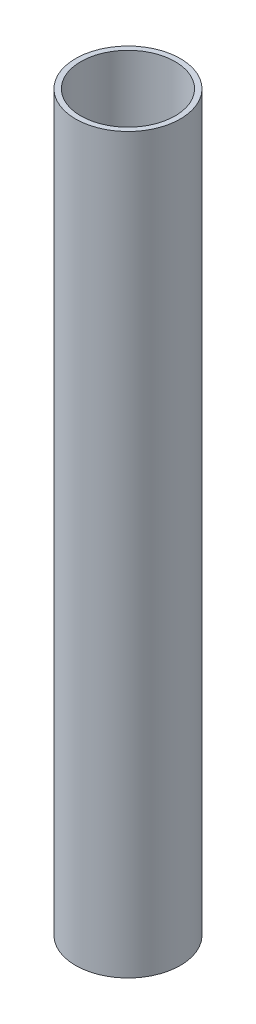
ISO-10303-21;
HEADER;
FILE_DESCRIPTION(('STEP AP214'),'2;1');
FILE_NAME('part.step','',(''),(''),'','','');
FILE_SCHEMA(('AUTOMOTIVE_DESIGN { 1 0 10303 214 1 1 1 1 }'));
ENDSEC;
DATA;
#1=APPLICATION_CONTEXT('core data for automotive mechanical design processes');
#2=APPLICATION_PROTOCOL_DEFINITION('international standard','automotive_design',2000,#1);
#3=PRODUCT_CONTEXT('',#1,'mechanical');
#4=PRODUCT('Part','Part','',(#3));
#5=PRODUCT_RELATED_PRODUCT_CATEGORY('part','',(#4));
#6=PRODUCT_DEFINITION_FORMATION('','',#4);
#7=PRODUCT_DEFINITION_CONTEXT('part definition',#1,'design');
#8=PRODUCT_DEFINITION('design','',#6,#7);
#9=PRODUCT_DEFINITION_SHAPE('','',#8);
#10=(LENGTH_UNIT() NAMED_UNIT(*) SI_UNIT(.MILLI.,.METRE.));
#11=(NAMED_UNIT(*) PLANE_ANGLE_UNIT() SI_UNIT($,.RADIAN.));
#12=(NAMED_UNIT(*) SI_UNIT($,.STERADIAN.) SOLID_ANGLE_UNIT());
#13=UNCERTAINTY_MEASURE_WITH_UNIT(LENGTH_MEASURE(1.E-05),#10,'distance_accuracy_value','');
#14=(GEOMETRIC_REPRESENTATION_CONTEXT(3) GLOBAL_UNCERTAINTY_ASSIGNED_CONTEXT((#13)) GLOBAL_UNIT_ASSIGNED_CONTEXT((#10,
#11,#12)) REPRESENTATION_CONTEXT('',''));
#15=CARTESIAN_POINT('',(0.,0.,0.));
#16=DIRECTION('',(0.,0.,1.));
#17=DIRECTION('',(1.,0.,0.));
#18=AXIS2_PLACEMENT_3D('',#15,#16,#17);
#19=CARTESIAN_POINT('',(0.,17.78,0.));
#20=DIRECTION('',(0.,1.,0.));
#21=DIRECTION('',(0.,0.,1.));
#22=AXIS2_PLACEMENT_3D('',#19,#20,#21);
#23=PLANE('',#22);
#24=CARTESIAN_POINT('',(0.,17.78,0.));
#25=DIRECTION('',(0.,1.,0.));
#26=DIRECTION('',(0.,0.,1.));
#27=AXIS2_PLACEMENT_3D('',#24,#25,#26);
#28=CIRCLE('',#27,1.27);
#29=CARTESIAN_POINT('',(0.,17.78,1.27));
#30=VERTEX_POINT('',#29);
#31=EDGE_CURVE('E10',#30,#30,#28,.T.);
#32=ORIENTED_EDGE('',*,*,#31,.T.);
#33=EDGE_LOOP('',(#32));
#34=FACE_BOUND('',#33,.T.);
#35=CARTESIAN_POINT('',(0.,17.78,0.));
#36=DIRECTION('',(0.,1.,0.));
#37=DIRECTION('',(0.,0.,1.));
#38=AXIS2_PLACEMENT_3D('',#35,#36,#37);
#39=CIRCLE('',#38,1.143);
#40=CARTESIAN_POINT('',(0.,17.78,1.143));
#41=VERTEX_POINT('',#40);
#42=EDGE_CURVE('E53',#41,#41,#39,.T.);
#43=ORIENTED_EDGE('',*,*,#42,.F.);
#44=EDGE_LOOP('',(#43));
#45=FACE_BOUND('',#44,.T.);
#46=ADVANCED_FACE('F39',(#34,#45),#23,.T.);
#47=CARTESIAN_POINT('',(0.,0.,0.));
#48=DIRECTION('',(0.,1.,0.));
#49=DIRECTION('',(0.,0.,1.));
#50=AXIS2_PLACEMENT_3D('',#47,#48,#49);
#51=PLANE('',#50);
#52=CARTESIAN_POINT('',(0.,0.,0.));
#53=DIRECTION('',(0.,1.,0.));
#54=DIRECTION('',(0.,0.,1.));
#55=AXIS2_PLACEMENT_3D('',#52,#53,#54);
#56=CIRCLE('',#55,1.27);
#57=CARTESIAN_POINT('',(0.,0.,1.27));
#58=VERTEX_POINT('',#57);
#59=EDGE_CURVE('E43',#58,#58,#56,.T.);
#60=ORIENTED_EDGE('',*,*,#59,.F.);
#61=EDGE_LOOP('',(#60));
#62=FACE_BOUND('',#61,.T.);
#63=CARTESIAN_POINT('',(0.,0.,0.));
#64=DIRECTION('',(0.,1.,0.));
#65=DIRECTION('',(0.,0.,1.));
#66=AXIS2_PLACEMENT_3D('',#63,#64,#65);
#67=CIRCLE('',#66,1.143);
#68=CARTESIAN_POINT('',(0.,0.,1.143));
#69=VERTEX_POINT('',#68);
#70=EDGE_CURVE('E55',#69,#69,#67,.T.);
#71=ORIENTED_EDGE('',*,*,#70,.T.);
#72=EDGE_LOOP('',(#71));
#73=FACE_BOUND('',#72,.T.);
#74=ADVANCED_FACE('F66',(#62,#73),#51,.F.);
#75=CARTESIAN_POINT('',(0.,17.78,0.));
#76=DIRECTION('',(0.,-1.,0.));
#77=DIRECTION('',(0.,0.,-1.));
#78=AXIS2_PLACEMENT_3D('',#75,#76,#77);
#79=CYLINDRICAL_SURFACE('',#78,1.27);
#80=ORIENTED_EDGE('',*,*,#31,.F.);
#81=EDGE_LOOP('',(#80));
#82=FACE_BOUND('',#81,.T.);
#83=ORIENTED_EDGE('',*,*,#59,.T.);
#84=EDGE_LOOP('',(#83));
#85=FACE_BOUND('',#84,.T.);
#86=ADVANCED_FACE('F41',(#82,#85),#79,.T.);
#87=CARTESIAN_POINT('',(0.,17.78,0.));
#88=DIRECTION('',(0.,-1.,0.));
#89=DIRECTION('',(0.,0.,-1.));
#90=AXIS2_PLACEMENT_3D('',#87,#88,#89);
#91=CYLINDRICAL_SURFACE('',#90,1.143);
#92=ORIENTED_EDGE('',*,*,#42,.T.);
#93=EDGE_LOOP('',(#92));
#94=FACE_BOUND('',#93,.T.);
#95=ORIENTED_EDGE('',*,*,#70,.F.);
#96=EDGE_LOOP('',(#95));
#97=FACE_BOUND('',#96,.T.);
#98=ADVANCED_FACE('F62',(#94,#97),#91,.F.);
#99=CLOSED_SHELL('',(#46,#74,#86,#98));
#100=MANIFOLD_SOLID_BREP('B2',#99);
#101=ADVANCED_BREP_SHAPE_REPRESENTATION('',(#18,#100),#14);
#102=SHAPE_DEFINITION_REPRESENTATION(#9,#101);
ENDSEC;
END-ISO-10303-21;
